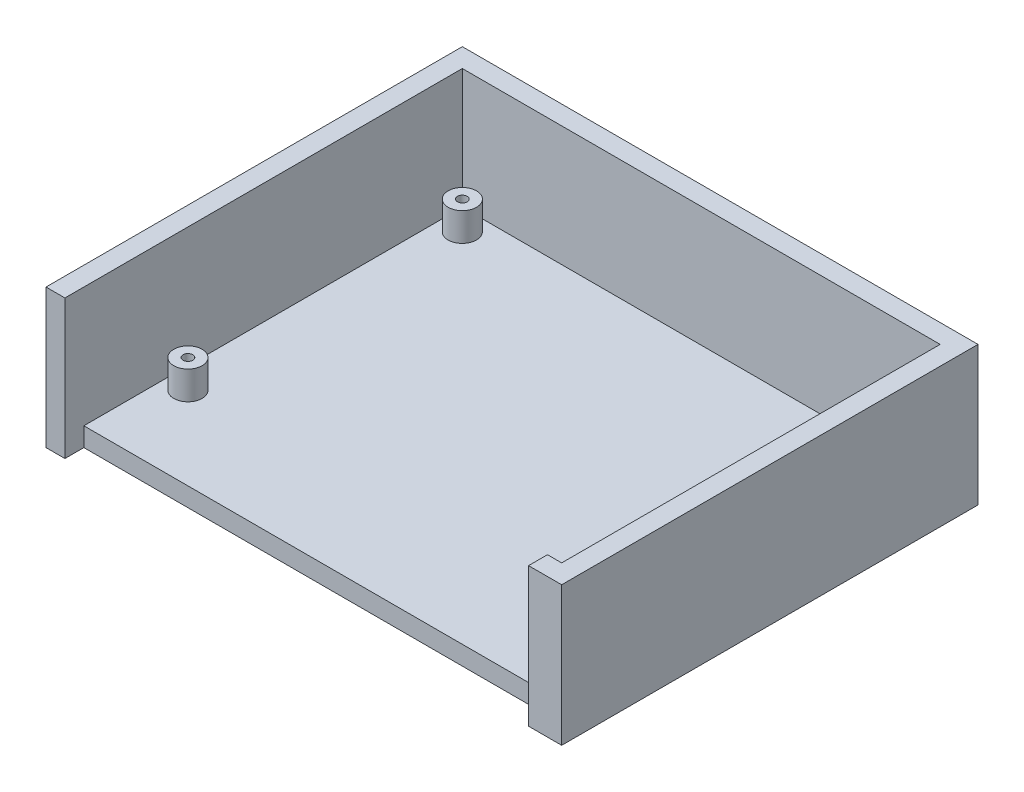
ISO-10303-21;
HEADER;
FILE_DESCRIPTION(('STEP AP214'),'2;1');
FILE_NAME('part.step','',(''),(''),'','','');
FILE_SCHEMA(('AUTOMOTIVE_DESIGN { 1 0 10303 214 1 1 1 1 }'));
ENDSEC;
DATA;
#1=APPLICATION_CONTEXT('core data for automotive mechanical design processes');
#2=APPLICATION_PROTOCOL_DEFINITION('international standard','automotive_design',2000,#1);
#3=PRODUCT_CONTEXT('',#1,'mechanical');
#4=PRODUCT('Part','Part','',(#3));
#5=PRODUCT_RELATED_PRODUCT_CATEGORY('part','',(#4));
#6=PRODUCT_DEFINITION_FORMATION('','',#4);
#7=PRODUCT_DEFINITION_CONTEXT('part definition',#1,'design');
#8=PRODUCT_DEFINITION('design','',#6,#7);
#9=PRODUCT_DEFINITION_SHAPE('','',#8);
#10=(LENGTH_UNIT() NAMED_UNIT(*) SI_UNIT(.MILLI.,.METRE.));
#11=(NAMED_UNIT(*) PLANE_ANGLE_UNIT() SI_UNIT($,.RADIAN.));
#12=(NAMED_UNIT(*) SI_UNIT($,.STERADIAN.) SOLID_ANGLE_UNIT());
#13=UNCERTAINTY_MEASURE_WITH_UNIT(LENGTH_MEASURE(1.E-05),#10,'distance_accuracy_value','');
#14=(GEOMETRIC_REPRESENTATION_CONTEXT(3) GLOBAL_UNCERTAINTY_ASSIGNED_CONTEXT((#13)) GLOBAL_UNIT_ASSIGNED_CONTEXT((#10,
#11,#12)) REPRESENTATION_CONTEXT('',''));
#15=CARTESIAN_POINT('',(0.,0.,0.));
#16=DIRECTION('',(0.,0.,1.));
#17=DIRECTION('',(1.,0.,0.));
#18=AXIS2_PLACEMENT_3D('',#15,#16,#17);
#19=CARTESIAN_POINT('',(50.5,4.,40.));
#20=DIRECTION('',(0.,0.,-1.));
#21=DIRECTION('',(-1.,0.,0.));
#22=AXIS2_PLACEMENT_3D('',#19,#20,#21);
#23=PLANE('',#22);
#24=DIRECTION('',(1.,0.,0.));
#25=VECTOR('',#24,1.);
#26=CARTESIAN_POINT('',(50.5,0.,40.));
#27=LINE('',#26,#25);
#28=CARTESIAN_POINT('',(-50.5,0.,40.));
#29=VERTEX_POINT('',#28);
#30=CARTESIAN_POINT('',(47.5,0.,40.));
#31=VERTEX_POINT('',#30);
#32=EDGE_CURVE('E61',#29,#31,#27,.T.);
#33=ORIENTED_EDGE('',*,*,#32,.T.);
#34=DIRECTION('',(0.,-1.,0.));
#35=VECTOR('',#34,1.);
#36=CARTESIAN_POINT('',(47.5,194.889257261219,40.));
#37=LINE('',#36,#35);
#38=CARTESIAN_POINT('',(47.5,4.,40.));
#39=VERTEX_POINT('',#38);
#40=EDGE_CURVE('E57',#39,#31,#37,.T.);
#41=ORIENTED_EDGE('',*,*,#40,.F.);
#42=DIRECTION('',(1.,0.,0.));
#43=VECTOR('',#42,1.);
#44=CARTESIAN_POINT('',(50.5,4.,40.));
#45=LINE('',#44,#43);
#46=CARTESIAN_POINT('',(-50.5,4.,40.));
#47=VERTEX_POINT('',#46);
#48=EDGE_CURVE('E205',#47,#39,#45,.T.);
#49=ORIENTED_EDGE('',*,*,#48,.F.);
#50=DIRECTION('',(0.,-1.,0.));
#51=VECTOR('',#50,1.);
#52=CARTESIAN_POINT('',(-50.5,4.,40.));
#53=LINE('',#52,#51);
#54=EDGE_CURVE('E12',#47,#29,#53,.T.);
#55=ORIENTED_EDGE('',*,*,#54,.T.);
#56=EDGE_LOOP('',(#33,#41,#49,#55));
#57=FACE_BOUND('',#56,.T.);
#58=ADVANCED_FACE('F43',(#57),#23,.F.);
#59=CARTESIAN_POINT('',(0.,4.,0.));
#60=DIRECTION('',(0.,1.,0.));
#61=DIRECTION('',(0.,0.,1.));
#62=AXIS2_PLACEMENT_3D('',#59,#60,#61);
#63=PLANE('',#62);
#64=CARTESIAN_POINT('',(40.,4.,22.5));
#65=DIRECTION('',(0.,1.,0.));
#66=DIRECTION('',(0.,0.,1.));
#67=AXIS2_PLACEMENT_3D('',#64,#65,#66);
#68=CIRCLE('',#67,3.);
#69=CARTESIAN_POINT('',(40.,4.,25.5));
#70=VERTEX_POINT('',#69);
#71=EDGE_CURVE('E602',#70,#70,#68,.T.);
#72=ORIENTED_EDGE('',*,*,#71,.F.);
#73=EDGE_LOOP('',(#72));
#74=FACE_BOUND('',#73,.T.);
#75=CARTESIAN_POINT('',(40.,4.,-35.5));
#76=DIRECTION('',(0.,1.,0.));
#77=DIRECTION('',(0.,0.,1.));
#78=AXIS2_PLACEMENT_3D('',#75,#76,#77);
#79=CIRCLE('',#78,3.);
#80=CARTESIAN_POINT('',(40.,4.,-32.5));
#81=VERTEX_POINT('',#80);
#82=EDGE_CURVE('E608',#81,#81,#79,.T.);
#83=ORIENTED_EDGE('',*,*,#82,.F.);
#84=EDGE_LOOP('',(#83));
#85=FACE_BOUND('',#84,.T.);
#86=CARTESIAN_POINT('',(-46.,4.,-35.5));
#87=DIRECTION('',(0.,1.,0.));
#88=DIRECTION('',(0.,0.,1.));
#89=AXIS2_PLACEMENT_3D('',#86,#87,#88);
#90=CIRCLE('',#89,3.);
#91=CARTESIAN_POINT('',(-46.,4.,-32.5));
#92=VERTEX_POINT('',#91);
#93=EDGE_CURVE('E614',#92,#92,#90,.T.);
#94=ORIENTED_EDGE('',*,*,#93,.F.);
#95=EDGE_LOOP('',(#94));
#96=FACE_BOUND('',#95,.T.);
#97=CARTESIAN_POINT('',(-46.,4.,22.5));
#98=DIRECTION('',(0.,1.,0.));
#99=DIRECTION('',(0.,0.,1.));
#100=AXIS2_PLACEMENT_3D('',#97,#98,#99);
#101=CIRCLE('',#100,3.);
#102=CARTESIAN_POINT('',(-46.,4.,25.5));
#103=VERTEX_POINT('',#102);
#104=EDGE_CURVE('E229',#103,#103,#101,.T.);
#105=ORIENTED_EDGE('',*,*,#104,.F.);
#106=EDGE_LOOP('',(#105));
#107=FACE_BOUND('',#106,.T.);
#108=DIRECTION('',(0.,0.,1.));
#109=VECTOR('',#108,1.);
#110=CARTESIAN_POINT('',(-50.5,4.,40.));
#111=LINE('',#110,#109);
#112=CARTESIAN_POINT('',(-50.5,4.,-40.));
#113=VERTEX_POINT('',#112);
#114=EDGE_CURVE('E202',#113,#47,#111,.T.);
#115=ORIENTED_EDGE('',*,*,#114,.T.);
#116=ORIENTED_EDGE('',*,*,#48,.T.);
#117=DIRECTION('',(-1.,0.,0.));
#118=VECTOR('',#117,1.);
#119=CARTESIAN_POINT('',(0.,4.,40.));
#120=LINE('',#119,#118);
#121=CARTESIAN_POINT('',(50.5,4.,40.));
#122=VERTEX_POINT('',#121);
#123=EDGE_CURVE('E199',#122,#39,#120,.T.);
#124=ORIENTED_EDGE('',*,*,#123,.F.);
#125=DIRECTION('',(0.,0.,-1.));
#126=VECTOR('',#125,1.);
#127=CARTESIAN_POINT('',(50.5,4.,40.));
#128=LINE('',#127,#126);
#129=CARTESIAN_POINT('',(50.5,4.,-40.));
#130=VERTEX_POINT('',#129);
#131=EDGE_CURVE('E207',#122,#130,#128,.T.);
#132=ORIENTED_EDGE('',*,*,#131,.T.);
#133=DIRECTION('',(-1.,0.,0.));
#134=VECTOR('',#133,1.);
#135=CARTESIAN_POINT('',(50.5,4.,-40.));
#136=LINE('',#135,#134);
#137=EDGE_CURVE('E50',#130,#113,#136,.T.);
#138=ORIENTED_EDGE('',*,*,#137,.T.);
#139=EDGE_LOOP('',(#115,#116,#124,#132,#138));
#140=FACE_BOUND('',#139,.T.);
#141=ADVANCED_FACE('F212',(#74,#85,#96,#107,#140),#63,.T.);
#142=CARTESIAN_POINT('',(0.,0.,0.));
#143=DIRECTION('',(0.,1.,0.));
#144=DIRECTION('',(0.,0.,1.));
#145=AXIS2_PLACEMENT_3D('',#142,#143,#144);
#146=PLANE('',#145);
#147=CARTESIAN_POINT('',(-46.,0.,22.5));
#148=DIRECTION('',(0.,1.,0.));
#149=DIRECTION('',(0.,0.,1.));
#150=AXIS2_PLACEMENT_3D('',#147,#148,#149);
#151=CIRCLE('',#150,1.025);
#152=CARTESIAN_POINT('',(-46.,0.,23.525));
#153=VERTEX_POINT('',#152);
#154=EDGE_CURVE('E576',#153,#153,#151,.T.);
#155=ORIENTED_EDGE('',*,*,#154,.T.);
#156=EDGE_LOOP('',(#155));
#157=FACE_BOUND('',#156,.T.);
#158=CARTESIAN_POINT('',(-46.,0.,-35.5));
#159=DIRECTION('',(0.,1.,0.));
#160=DIRECTION('',(0.,0.,1.));
#161=AXIS2_PLACEMENT_3D('',#158,#159,#160);
#162=CIRCLE('',#161,1.025);
#163=CARTESIAN_POINT('',(-46.,0.,-34.475));
#164=VERTEX_POINT('',#163);
#165=EDGE_CURVE('E586',#164,#164,#162,.T.);
#166=ORIENTED_EDGE('',*,*,#165,.T.);
#167=EDGE_LOOP('',(#166));
#168=FACE_BOUND('',#167,.T.);
#169=CARTESIAN_POINT('',(40.,0.,-35.5));
#170=DIRECTION('',(0.,1.,0.));
#171=DIRECTION('',(0.,0.,1.));
#172=AXIS2_PLACEMENT_3D('',#169,#170,#171);
#173=CIRCLE('',#172,1.025);
#174=CARTESIAN_POINT('',(40.,0.,-34.475));
#175=VERTEX_POINT('',#174);
#176=EDGE_CURVE('E592',#175,#175,#173,.T.);
#177=ORIENTED_EDGE('',*,*,#176,.T.);
#178=EDGE_LOOP('',(#177));
#179=FACE_BOUND('',#178,.T.);
#180=CARTESIAN_POINT('',(40.,0.,22.5));
#181=DIRECTION('',(0.,1.,0.));
#182=DIRECTION('',(0.,0.,1.));
#183=AXIS2_PLACEMENT_3D('',#180,#181,#182);
#184=CIRCLE('',#183,1.025);
#185=CARTESIAN_POINT('',(40.,0.,23.525));
#186=VERTEX_POINT('',#185);
#187=EDGE_CURVE('E598',#186,#186,#184,.T.);
#188=ORIENTED_EDGE('',*,*,#187,.T.);
#189=EDGE_LOOP('',(#188));
#190=FACE_BOUND('',#189,.T.);
#191=ORIENTED_EDGE('',*,*,#32,.F.);
#192=DIRECTION('',(0.,0.,1.));
#193=VECTOR('',#192,1.);
#194=CARTESIAN_POINT('',(-50.5,0.,-40.));
#195=LINE('',#194,#193);
#196=CARTESIAN_POINT('',(-50.5,0.,44.));
#197=VERTEX_POINT('',#196);
#198=EDGE_CURVE('E223',#29,#197,#195,.T.);
#199=ORIENTED_EDGE('',*,*,#198,.T.);
#200=DIRECTION('',(-1.,0.,0.));
#201=VECTOR('',#200,1.);
#202=CARTESIAN_POINT('',(-50.5,0.,44.));
#203=LINE('',#202,#201);
#204=CARTESIAN_POINT('',(-54.5,0.,44.));
#205=VERTEX_POINT('',#204);
#206=EDGE_CURVE('E156',#197,#205,#203,.T.);
#207=ORIENTED_EDGE('',*,*,#206,.T.);
#208=DIRECTION('',(0.,0.,-1.));
#209=VECTOR('',#208,1.);
#210=CARTESIAN_POINT('',(-54.5,0.,44.));
#211=LINE('',#210,#209);
#212=CARTESIAN_POINT('',(-54.5,0.,-44.));
#213=VERTEX_POINT('',#212);
#214=EDGE_CURVE('E140',#205,#213,#211,.T.);
#215=ORIENTED_EDGE('',*,*,#214,.T.);
#216=DIRECTION('',(1.,0.,0.));
#217=VECTOR('',#216,1.);
#218=CARTESIAN_POINT('',(54.5,0.,-44.));
#219=LINE('',#218,#217);
#220=CARTESIAN_POINT('',(54.5,0.,-44.));
#221=VERTEX_POINT('',#220);
#222=EDGE_CURVE('E225',#213,#221,#219,.T.);
#223=ORIENTED_EDGE('',*,*,#222,.T.);
#224=DIRECTION('',(0.,0.,1.));
#225=VECTOR('',#224,1.);
#226=CARTESIAN_POINT('',(54.5,0.,44.));
#227=LINE('',#226,#225);
#228=CARTESIAN_POINT('',(54.5,0.,44.));
#229=VERTEX_POINT('',#228);
#230=EDGE_CURVE('E235',#221,#229,#227,.T.);
#231=ORIENTED_EDGE('',*,*,#230,.T.);
#232=DIRECTION('',(-1.,0.,0.));
#233=VECTOR('',#232,1.);
#234=CARTESIAN_POINT('',(54.5,0.,44.));
#235=LINE('',#234,#233);
#236=CARTESIAN_POINT('',(47.5,0.,44.));
#237=VERTEX_POINT('',#236);
#238=EDGE_CURVE('E152',#229,#237,#235,.T.);
#239=ORIENTED_EDGE('',*,*,#238,.T.);
#240=DIRECTION('',(0.,0.,-1.));
#241=VECTOR('',#240,1.);
#242=CARTESIAN_POINT('',(47.5,0.,44.));
#243=LINE('',#242,#241);
#244=EDGE_CURVE('E149',#237,#31,#243,.T.);
#245=ORIENTED_EDGE('',*,*,#244,.T.);
#246=EDGE_LOOP('',(#191,#199,#207,#215,#223,#231,#239,#245));
#247=FACE_BOUND('',#246,.T.);
#248=ADVANCED_FACE('F240',(#157,#168,#179,#190,#247),#146,.F.);
#249=CARTESIAN_POINT('',(-50.5,194.889257261219,-40.));
#250=DIRECTION('',(1.,0.,0.));
#251=DIRECTION('',(0.,0.,-1.));
#252=AXIS2_PLACEMENT_3D('',#249,#250,#251);
#253=PLANE('',#252);
#254=ORIENTED_EDGE('',*,*,#54,.F.);
#255=ORIENTED_EDGE('',*,*,#114,.F.);
#256=DIRECTION('',(0.,-1.,0.));
#257=VECTOR('',#256,1.);
#258=CARTESIAN_POINT('',(-50.5,194.889257261219,-40.));
#259=LINE('',#258,#257);
#260=CARTESIAN_POINT('',(-50.5,29.4,-40.));
#261=VERTEX_POINT('',#260);
#262=EDGE_CURVE('E160',#261,#113,#259,.T.);
#263=ORIENTED_EDGE('',*,*,#262,.F.);
#264=DIRECTION('',(0.,0.,1.));
#265=VECTOR('',#264,1.);
#266=CARTESIAN_POINT('',(-50.5,29.4,-40.));
#267=LINE('',#266,#265);
#268=CARTESIAN_POINT('',(-50.5,29.4,44.));
#269=VERTEX_POINT('',#268);
#270=EDGE_CURVE('E158',#261,#269,#267,.T.);
#271=ORIENTED_EDGE('',*,*,#270,.T.);
#272=DIRECTION('',(0.,-1.,0.));
#273=VECTOR('',#272,1.);
#274=CARTESIAN_POINT('',(-50.5,194.889257261219,44.));
#275=LINE('',#274,#273);
#276=EDGE_CURVE('E148',#269,#197,#275,.T.);
#277=ORIENTED_EDGE('',*,*,#276,.T.);
#278=ORIENTED_EDGE('',*,*,#198,.F.);
#279=EDGE_LOOP('',(#254,#255,#263,#271,#277,#278));
#280=FACE_BOUND('',#279,.T.);
#281=ADVANCED_FACE('F219',(#280),#253,.T.);
#282=CARTESIAN_POINT('',(0.,29.4,0.));
#283=DIRECTION('',(0.,1.,0.));
#284=DIRECTION('',(0.,0.,1.));
#285=AXIS2_PLACEMENT_3D('',#282,#283,#284);
#286=PLANE('',#285);
#287=ORIENTED_EDGE('',*,*,#270,.F.);
#288=DIRECTION('',(-1.,0.,0.));
#289=VECTOR('',#288,1.);
#290=CARTESIAN_POINT('',(50.5,29.4,-40.));
#291=LINE('',#290,#289);
#292=CARTESIAN_POINT('',(50.5,29.4,-40.));
#293=VERTEX_POINT('',#292);
#294=EDGE_CURVE('E161',#293,#261,#291,.T.);
#295=ORIENTED_EDGE('',*,*,#294,.F.);
#296=DIRECTION('',(0.,0.,-1.));
#297=VECTOR('',#296,1.);
#298=CARTESIAN_POINT('',(50.5,29.4,-40.));
#299=LINE('',#298,#297);
#300=CARTESIAN_POINT('',(50.5,29.4,40.));
#301=VERTEX_POINT('',#300);
#302=EDGE_CURVE('E165',#301,#293,#299,.T.);
#303=ORIENTED_EDGE('',*,*,#302,.F.);
#304=DIRECTION('',(1.,0.,0.));
#305=VECTOR('',#304,1.);
#306=CARTESIAN_POINT('',(47.5,29.4,40.));
#307=LINE('',#306,#305);
#308=CARTESIAN_POINT('',(47.5,29.4,40.));
#309=VERTEX_POINT('',#308);
#310=EDGE_CURVE('E169',#309,#301,#307,.T.);
#311=ORIENTED_EDGE('',*,*,#310,.F.);
#312=DIRECTION('',(0.,0.,-1.));
#313=VECTOR('',#312,1.);
#314=CARTESIAN_POINT('',(47.5,29.4,44.));
#315=LINE('',#314,#313);
#316=CARTESIAN_POINT('',(47.5,29.4,44.));
#317=VERTEX_POINT('',#316);
#318=EDGE_CURVE('E173',#317,#309,#315,.T.);
#319=ORIENTED_EDGE('',*,*,#318,.F.);
#320=DIRECTION('',(-1.,0.,0.));
#321=VECTOR('',#320,1.);
#322=CARTESIAN_POINT('',(54.5,29.4,44.));
#323=LINE('',#322,#321);
#324=CARTESIAN_POINT('',(54.5,29.4,44.));
#325=VERTEX_POINT('',#324);
#326=EDGE_CURVE('E177',#325,#317,#323,.T.);
#327=ORIENTED_EDGE('',*,*,#326,.F.);
#328=DIRECTION('',(0.,0.,1.));
#329=VECTOR('',#328,1.);
#330=CARTESIAN_POINT('',(54.5,29.4,44.));
#331=LINE('',#330,#329);
#332=CARTESIAN_POINT('',(54.5,29.4,-44.));
#333=VERTEX_POINT('',#332);
#334=EDGE_CURVE('E181',#333,#325,#331,.T.);
#335=ORIENTED_EDGE('',*,*,#334,.F.);
#336=DIRECTION('',(1.,0.,0.));
#337=VECTOR('',#336,1.);
#338=CARTESIAN_POINT('',(54.5,29.4,-44.));
#339=LINE('',#338,#337);
#340=CARTESIAN_POINT('',(-54.5,29.4,-44.));
#341=VERTEX_POINT('',#340);
#342=EDGE_CURVE('E131',#341,#333,#339,.T.);
#343=ORIENTED_EDGE('',*,*,#342,.F.);
#344=DIRECTION('',(0.,0.,-1.));
#345=VECTOR('',#344,1.);
#346=CARTESIAN_POINT('',(-54.5,29.4,44.));
#347=LINE('',#346,#345);
#348=CARTESIAN_POINT('',(-54.5,29.4,44.));
#349=VERTEX_POINT('',#348);
#350=EDGE_CURVE('E124',#349,#341,#347,.T.);
#351=ORIENTED_EDGE('',*,*,#350,.F.);
#352=DIRECTION('',(-1.,0.,0.));
#353=VECTOR('',#352,1.);
#354=CARTESIAN_POINT('',(-50.5,29.4,44.));
#355=LINE('',#354,#353);
#356=EDGE_CURVE('E128',#269,#349,#355,.T.);
#357=ORIENTED_EDGE('',*,*,#356,.F.);
#358=EDGE_LOOP('',(#287,#295,#303,#311,#319,#327,#335,#343,#351,#357));
#359=FACE_BOUND('',#358,.T.);
#360=ADVANCED_FACE('F126',(#359),#286,.T.);
#361=CARTESIAN_POINT('',(-50.5,194.889257261219,44.));
#362=DIRECTION('',(0.,0.,1.));
#363=DIRECTION('',(1.,0.,0.));
#364=AXIS2_PLACEMENT_3D('',#361,#362,#363);
#365=PLANE('',#364);
#366=ORIENTED_EDGE('',*,*,#276,.F.);
#367=ORIENTED_EDGE('',*,*,#356,.T.);
#368=DIRECTION('',(0.,-1.,0.));
#369=VECTOR('',#368,1.);
#370=CARTESIAN_POINT('',(-54.5,194.889257261219,44.));
#371=LINE('',#370,#369);
#372=EDGE_CURVE('E135',#349,#205,#371,.T.);
#373=ORIENTED_EDGE('',*,*,#372,.T.);
#374=ORIENTED_EDGE('',*,*,#206,.F.);
#375=EDGE_LOOP('',(#366,#367,#373,#374));
#376=FACE_BOUND('',#375,.T.);
#377=ADVANCED_FACE('F146',(#376),#365,.T.);
#378=CARTESIAN_POINT('',(-54.5,194.889257261219,44.));
#379=DIRECTION('',(-1.,0.,0.));
#380=DIRECTION('',(0.,0.,1.));
#381=AXIS2_PLACEMENT_3D('',#378,#379,#380);
#382=PLANE('',#381);
#383=ORIENTED_EDGE('',*,*,#372,.F.);
#384=ORIENTED_EDGE('',*,*,#350,.T.);
#385=DIRECTION('',(0.,-1.,0.));
#386=VECTOR('',#385,1.);
#387=CARTESIAN_POINT('',(-54.5,194.889257261219,-44.));
#388=LINE('',#387,#386);
#389=EDGE_CURVE('E134',#341,#213,#388,.T.);
#390=ORIENTED_EDGE('',*,*,#389,.T.);
#391=ORIENTED_EDGE('',*,*,#214,.F.);
#392=EDGE_LOOP('',(#383,#384,#390,#391));
#393=FACE_BOUND('',#392,.T.);
#394=ADVANCED_FACE('F138',(#393),#382,.T.);
#395=CARTESIAN_POINT('',(54.5,194.889257261219,-44.));
#396=DIRECTION('',(0.,0.,-1.));
#397=DIRECTION('',(-1.,0.,0.));
#398=AXIS2_PLACEMENT_3D('',#395,#396,#397);
#399=PLANE('',#398);
#400=ORIENTED_EDGE('',*,*,#389,.F.);
#401=ORIENTED_EDGE('',*,*,#342,.T.);
#402=DIRECTION('',(0.,-1.,0.));
#403=VECTOR('',#402,1.);
#404=CARTESIAN_POINT('',(54.5,194.889257261219,-44.));
#405=LINE('',#404,#403);
#406=EDGE_CURVE('E184',#333,#221,#405,.T.);
#407=ORIENTED_EDGE('',*,*,#406,.T.);
#408=ORIENTED_EDGE('',*,*,#222,.F.);
#409=EDGE_LOOP('',(#400,#401,#407,#408));
#410=FACE_BOUND('',#409,.T.);
#411=ADVANCED_FACE('F243',(#410),#399,.T.);
#412=CARTESIAN_POINT('',(54.5,194.889257261219,44.));
#413=DIRECTION('',(1.,0.,0.));
#414=DIRECTION('',(0.,0.,-1.));
#415=AXIS2_PLACEMENT_3D('',#412,#413,#414);
#416=PLANE('',#415);
#417=ORIENTED_EDGE('',*,*,#406,.F.);
#418=ORIENTED_EDGE('',*,*,#334,.T.);
#419=DIRECTION('',(0.,-1.,0.));
#420=VECTOR('',#419,1.);
#421=CARTESIAN_POINT('',(54.5,194.889257261219,44.));
#422=LINE('',#421,#420);
#423=EDGE_CURVE('E180',#325,#229,#422,.T.);
#424=ORIENTED_EDGE('',*,*,#423,.T.);
#425=ORIENTED_EDGE('',*,*,#230,.F.);
#426=EDGE_LOOP('',(#417,#418,#424,#425));
#427=FACE_BOUND('',#426,.T.);
#428=ADVANCED_FACE('F246',(#427),#416,.T.);
#429=CARTESIAN_POINT('',(54.5,194.889257261219,44.));
#430=DIRECTION('',(0.,0.,1.));
#431=DIRECTION('',(1.,0.,0.));
#432=AXIS2_PLACEMENT_3D('',#429,#430,#431);
#433=PLANE('',#432);
#434=ORIENTED_EDGE('',*,*,#423,.F.);
#435=ORIENTED_EDGE('',*,*,#326,.T.);
#436=DIRECTION('',(0.,-1.,0.));
#437=VECTOR('',#436,1.);
#438=CARTESIAN_POINT('',(47.5,194.889257261219,44.));
#439=LINE('',#438,#437);
#440=EDGE_CURVE('E176',#317,#237,#439,.T.);
#441=ORIENTED_EDGE('',*,*,#440,.T.);
#442=ORIENTED_EDGE('',*,*,#238,.F.);
#443=EDGE_LOOP('',(#434,#435,#441,#442));
#444=FACE_BOUND('',#443,.T.);
#445=ADVANCED_FACE('F250',(#444),#433,.T.);
#446=CARTESIAN_POINT('',(47.5,194.889257261219,44.));
#447=DIRECTION('',(-1.,0.,0.));
#448=DIRECTION('',(0.,0.,1.));
#449=AXIS2_PLACEMENT_3D('',#446,#447,#448);
#450=PLANE('',#449);
#451=ORIENTED_EDGE('',*,*,#440,.F.);
#452=ORIENTED_EDGE('',*,*,#318,.T.);
#453=EDGE_CURVE('E172',#309,#39,#37,.T.);
#454=ORIENTED_EDGE('',*,*,#453,.T.);
#455=ORIENTED_EDGE('',*,*,#40,.T.);
#456=ORIENTED_EDGE('',*,*,#244,.F.);
#457=EDGE_LOOP('',(#451,#452,#454,#455,#456));
#458=FACE_BOUND('',#457,.T.);
#459=ADVANCED_FACE('F254',(#458),#450,.T.);
#460=CARTESIAN_POINT('',(47.5,194.889257261219,40.));
#461=DIRECTION('',(0.,0.,-1.));
#462=DIRECTION('',(-1.,0.,0.));
#463=AXIS2_PLACEMENT_3D('',#460,#461,#462);
#464=PLANE('',#463);
#465=DIRECTION('',(0.,-1.,0.));
#466=VECTOR('',#465,1.);
#467=CARTESIAN_POINT('',(50.5,194.889257261219,40.));
#468=LINE('',#467,#466);
#469=EDGE_CURVE('E168',#301,#122,#468,.T.);
#470=ORIENTED_EDGE('',*,*,#469,.T.);
#471=ORIENTED_EDGE('',*,*,#123,.T.);
#472=ORIENTED_EDGE('',*,*,#453,.F.);
#473=ORIENTED_EDGE('',*,*,#310,.T.);
#474=EDGE_LOOP('',(#470,#471,#472,#473));
#475=FACE_BOUND('',#474,.T.);
#476=ADVANCED_FACE('F257',(#475),#464,.T.);
#477=CARTESIAN_POINT('',(50.5,194.889257261219,-40.));
#478=DIRECTION('',(-1.,0.,0.));
#479=DIRECTION('',(0.,0.,1.));
#480=AXIS2_PLACEMENT_3D('',#477,#478,#479);
#481=PLANE('',#480);
#482=DIRECTION('',(0.,-1.,0.));
#483=VECTOR('',#482,1.);
#484=CARTESIAN_POINT('',(50.5,194.889257261219,-40.));
#485=LINE('',#484,#483);
#486=EDGE_CURVE('E164',#293,#130,#485,.T.);
#487=ORIENTED_EDGE('',*,*,#486,.T.);
#488=ORIENTED_EDGE('',*,*,#131,.F.);
#489=ORIENTED_EDGE('',*,*,#469,.F.);
#490=ORIENTED_EDGE('',*,*,#302,.T.);
#491=EDGE_LOOP('',(#487,#488,#489,#490));
#492=FACE_BOUND('',#491,.T.);
#493=ADVANCED_FACE('F259',(#492),#481,.T.);
#494=CARTESIAN_POINT('',(50.5,194.889257261219,-40.));
#495=DIRECTION('',(0.,0.,1.));
#496=DIRECTION('',(1.,0.,0.));
#497=AXIS2_PLACEMENT_3D('',#494,#495,#496);
#498=PLANE('',#497);
#499=ORIENTED_EDGE('',*,*,#262,.T.);
#500=ORIENTED_EDGE('',*,*,#137,.F.);
#501=ORIENTED_EDGE('',*,*,#486,.F.);
#502=ORIENTED_EDGE('',*,*,#294,.T.);
#503=EDGE_LOOP('',(#499,#500,#501,#502));
#504=FACE_BOUND('',#503,.T.);
#505=ADVANCED_FACE('F221',(#504),#498,.T.);
#506=CARTESIAN_POINT('',(-46.,10.,22.5));
#507=DIRECTION('',(0.,-1.,0.));
#508=DIRECTION('',(0.,0.,-1.));
#509=AXIS2_PLACEMENT_3D('',#506,#507,#508);
#510=CYLINDRICAL_SURFACE('',#509,3.);
#511=CARTESIAN_POINT('',(-46.,10.,22.5));
#512=DIRECTION('',(0.,1.,0.));
#513=DIRECTION('',(0.,0.,1.));
#514=AXIS2_PLACEMENT_3D('',#511,#512,#513);
#515=CIRCLE('',#514,3.);
#516=CARTESIAN_POINT('',(-46.,10.,25.5));
#517=VERTEX_POINT('',#516);
#518=EDGE_CURVE('E226',#517,#517,#515,.T.);
#519=ORIENTED_EDGE('',*,*,#518,.F.);
#520=EDGE_LOOP('',(#519));
#521=FACE_BOUND('',#520,.T.);
#522=ORIENTED_EDGE('',*,*,#104,.T.);
#523=EDGE_LOOP('',(#522));
#524=FACE_BOUND('',#523,.T.);
#525=ADVANCED_FACE('F266',(#521,#524),#510,.T.);
#526=CARTESIAN_POINT('',(-46.,10.,22.5));
#527=DIRECTION('',(0.,1.,0.));
#528=DIRECTION('',(0.,0.,1.));
#529=AXIS2_PLACEMENT_3D('',#526,#527,#528);
#530=PLANE('',#529);
#531=CARTESIAN_POINT('',(-46.,10.,22.5));
#532=DIRECTION('',(0.,1.,0.));
#533=DIRECTION('',(0.,0.,1.));
#534=AXIS2_PLACEMENT_3D('',#531,#532,#533);
#535=CIRCLE('',#534,1.025);
#536=CARTESIAN_POINT('',(-46.,10.,23.525));
#537=VERTEX_POINT('',#536);
#538=EDGE_CURVE('E579',#537,#537,#535,.T.);
#539=ORIENTED_EDGE('',*,*,#538,.F.);
#540=EDGE_LOOP('',(#539));
#541=FACE_BOUND('',#540,.T.);
#542=ORIENTED_EDGE('',*,*,#518,.T.);
#543=EDGE_LOOP('',(#542));
#544=FACE_BOUND('',#543,.T.);
#545=ADVANCED_FACE('F332',(#541,#544),#530,.T.);
#546=CARTESIAN_POINT('',(-46.,10.,-35.5));
#547=DIRECTION('',(0.,-1.,0.));
#548=DIRECTION('',(0.,0.,-1.));
#549=AXIS2_PLACEMENT_3D('',#546,#547,#548);
#550=CYLINDRICAL_SURFACE('',#549,3.);
#551=CARTESIAN_POINT('',(-46.,10.,-35.5));
#552=DIRECTION('',(0.,1.,0.));
#553=DIRECTION('',(0.,0.,1.));
#554=AXIS2_PLACEMENT_3D('',#551,#552,#553);
#555=CIRCLE('',#554,3.);
#556=CARTESIAN_POINT('',(-46.,10.,-32.5));
#557=VERTEX_POINT('',#556);
#558=EDGE_CURVE('E611',#557,#557,#555,.T.);
#559=ORIENTED_EDGE('',*,*,#558,.F.);
#560=EDGE_LOOP('',(#559));
#561=FACE_BOUND('',#560,.T.);
#562=ORIENTED_EDGE('',*,*,#93,.T.);
#563=EDGE_LOOP('',(#562));
#564=FACE_BOUND('',#563,.T.);
#565=ADVANCED_FACE('F341',(#561,#564),#550,.T.);
#566=CARTESIAN_POINT('',(-46.,10.,-35.5));
#567=DIRECTION('',(0.,1.,0.));
#568=DIRECTION('',(0.,0.,1.));
#569=AXIS2_PLACEMENT_3D('',#566,#567,#568);
#570=PLANE('',#569);
#571=CARTESIAN_POINT('',(-46.,10.,-35.5));
#572=DIRECTION('',(0.,1.,0.));
#573=DIRECTION('',(0.,0.,1.));
#574=AXIS2_PLACEMENT_3D('',#571,#572,#573);
#575=CIRCLE('',#574,1.025);
#576=CARTESIAN_POINT('',(-46.,10.,-34.475));
#577=VERTEX_POINT('',#576);
#578=EDGE_CURVE('E581',#577,#577,#575,.T.);
#579=ORIENTED_EDGE('',*,*,#578,.F.);
#580=EDGE_LOOP('',(#579));
#581=FACE_BOUND('',#580,.T.);
#582=ORIENTED_EDGE('',*,*,#558,.T.);
#583=EDGE_LOOP('',(#582));
#584=FACE_BOUND('',#583,.T.);
#585=ADVANCED_FACE('F346',(#581,#584),#570,.T.);
#586=CARTESIAN_POINT('',(40.,10.,-35.5));
#587=DIRECTION('',(0.,-1.,0.));
#588=DIRECTION('',(0.,0.,-1.));
#589=AXIS2_PLACEMENT_3D('',#586,#587,#588);
#590=CYLINDRICAL_SURFACE('',#589,3.);
#591=CARTESIAN_POINT('',(40.,10.,-35.5));
#592=DIRECTION('',(0.,1.,0.));
#593=DIRECTION('',(0.,0.,1.));
#594=AXIS2_PLACEMENT_3D('',#591,#592,#593);
#595=CIRCLE('',#594,3.);
#596=CARTESIAN_POINT('',(40.,10.,-32.5));
#597=VERTEX_POINT('',#596);
#598=EDGE_CURVE('E605',#597,#597,#595,.T.);
#599=ORIENTED_EDGE('',*,*,#598,.F.);
#600=EDGE_LOOP('',(#599));
#601=FACE_BOUND('',#600,.T.);
#602=ORIENTED_EDGE('',*,*,#82,.T.);
#603=EDGE_LOOP('',(#602));
#604=FACE_BOUND('',#603,.T.);
#605=ADVANCED_FACE('F355',(#601,#604),#590,.T.);
#606=CARTESIAN_POINT('',(40.,10.,-35.5));
#607=DIRECTION('',(0.,1.,0.));
#608=DIRECTION('',(0.,0.,1.));
#609=AXIS2_PLACEMENT_3D('',#606,#607,#608);
#610=PLANE('',#609);
#611=CARTESIAN_POINT('',(40.,10.,-35.5));
#612=DIRECTION('',(0.,1.,0.));
#613=DIRECTION('',(0.,0.,1.));
#614=AXIS2_PLACEMENT_3D('',#611,#612,#613);
#615=CIRCLE('',#614,1.025);
#616=CARTESIAN_POINT('',(40.,10.,-34.475));
#617=VERTEX_POINT('',#616);
#618=EDGE_CURVE('E589',#617,#617,#615,.T.);
#619=ORIENTED_EDGE('',*,*,#618,.F.);
#620=EDGE_LOOP('',(#619));
#621=FACE_BOUND('',#620,.T.);
#622=ORIENTED_EDGE('',*,*,#598,.T.);
#623=EDGE_LOOP('',(#622));
#624=FACE_BOUND('',#623,.T.);
#625=ADVANCED_FACE('F360',(#621,#624),#610,.T.);
#626=CARTESIAN_POINT('',(40.,10.,22.5));
#627=DIRECTION('',(0.,-1.,0.));
#628=DIRECTION('',(0.,0.,-1.));
#629=AXIS2_PLACEMENT_3D('',#626,#627,#628);
#630=CYLINDRICAL_SURFACE('',#629,3.);
#631=CARTESIAN_POINT('',(40.,10.,22.5));
#632=DIRECTION('',(0.,1.,0.));
#633=DIRECTION('',(0.,0.,1.));
#634=AXIS2_PLACEMENT_3D('',#631,#632,#633);
#635=CIRCLE('',#634,3.);
#636=CARTESIAN_POINT('',(40.,10.,25.5));
#637=VERTEX_POINT('',#636);
#638=EDGE_CURVE('E601',#637,#637,#635,.T.);
#639=ORIENTED_EDGE('',*,*,#638,.F.);
#640=EDGE_LOOP('',(#639));
#641=FACE_BOUND('',#640,.T.);
#642=ORIENTED_EDGE('',*,*,#71,.T.);
#643=EDGE_LOOP('',(#642));
#644=FACE_BOUND('',#643,.T.);
#645=ADVANCED_FACE('F369',(#641,#644),#630,.T.);
#646=CARTESIAN_POINT('',(40.,10.,22.5));
#647=DIRECTION('',(0.,1.,0.));
#648=DIRECTION('',(0.,0.,1.));
#649=AXIS2_PLACEMENT_3D('',#646,#647,#648);
#650=PLANE('',#649);
#651=CARTESIAN_POINT('',(40.,10.,22.5));
#652=DIRECTION('',(0.,1.,0.));
#653=DIRECTION('',(0.,0.,1.));
#654=AXIS2_PLACEMENT_3D('',#651,#652,#653);
#655=CIRCLE('',#654,1.025);
#656=CARTESIAN_POINT('',(40.,10.,23.525));
#657=VERTEX_POINT('',#656);
#658=EDGE_CURVE('E595',#657,#657,#655,.T.);
#659=ORIENTED_EDGE('',*,*,#658,.F.);
#660=EDGE_LOOP('',(#659));
#661=FACE_BOUND('',#660,.T.);
#662=ORIENTED_EDGE('',*,*,#638,.T.);
#663=EDGE_LOOP('',(#662));
#664=FACE_BOUND('',#663,.T.);
#665=ADVANCED_FACE('F374',(#661,#664),#650,.T.);
#666=CARTESIAN_POINT('',(40.,10.,22.5));
#667=DIRECTION('',(0.,1.,0.));
#668=DIRECTION('',(0.,0.,1.));
#669=AXIS2_PLACEMENT_3D('',#666,#667,#668);
#670=CYLINDRICAL_SURFACE('',#669,1.025);
#671=ORIENTED_EDGE('',*,*,#187,.F.);
#672=EDGE_LOOP('',(#671));
#673=FACE_BOUND('',#672,.T.);
#674=ORIENTED_EDGE('',*,*,#658,.T.);
#675=EDGE_LOOP('',(#674));
#676=FACE_BOUND('',#675,.T.);
#677=ADVANCED_FACE('F424',(#673,#676),#670,.F.);
#678=CARTESIAN_POINT('',(40.,10.,-35.5));
#679=DIRECTION('',(0.,1.,0.));
#680=DIRECTION('',(0.,0.,1.));
#681=AXIS2_PLACEMENT_3D('',#678,#679,#680);
#682=CYLINDRICAL_SURFACE('',#681,1.025);
#683=ORIENTED_EDGE('',*,*,#176,.F.);
#684=EDGE_LOOP('',(#683));
#685=FACE_BOUND('',#684,.T.);
#686=ORIENTED_EDGE('',*,*,#618,.T.);
#687=EDGE_LOOP('',(#686));
#688=FACE_BOUND('',#687,.T.);
#689=ADVANCED_FACE('F437',(#685,#688),#682,.F.);
#690=CARTESIAN_POINT('',(-46.,10.,-35.5));
#691=DIRECTION('',(0.,1.,0.));
#692=DIRECTION('',(0.,0.,1.));
#693=AXIS2_PLACEMENT_3D('',#690,#691,#692);
#694=CYLINDRICAL_SURFACE('',#693,1.025);
#695=ORIENTED_EDGE('',*,*,#165,.F.);
#696=EDGE_LOOP('',(#695));
#697=FACE_BOUND('',#696,.T.);
#698=ORIENTED_EDGE('',*,*,#578,.T.);
#699=EDGE_LOOP('',(#698));
#700=FACE_BOUND('',#699,.T.);
#701=ADVANCED_FACE('F449',(#697,#700),#694,.F.);
#702=CARTESIAN_POINT('',(-46.,10.,22.5));
#703=DIRECTION('',(0.,1.,0.));
#704=DIRECTION('',(0.,0.,1.));
#705=AXIS2_PLACEMENT_3D('',#702,#703,#704);
#706=CYLINDRICAL_SURFACE('',#705,1.025);
#707=ORIENTED_EDGE('',*,*,#154,.F.);
#708=EDGE_LOOP('',(#707));
#709=FACE_BOUND('',#708,.T.);
#710=ORIENTED_EDGE('',*,*,#538,.T.);
#711=EDGE_LOOP('',(#710));
#712=FACE_BOUND('',#711,.T.);
#713=ADVANCED_FACE('F461',(#709,#712),#706,.F.);
#714=CLOSED_SHELL('',(#58,#141,#248,#281,#360,#377,#394,#411,#428,#445,#459,#476,#493,#505,#525,
#545,#565,#585,#605,#625,#645,#665,#677,#689,#701,#713));
#715=MANIFOLD_SOLID_BREP('B2',#714);
#716=ADVANCED_BREP_SHAPE_REPRESENTATION('',(#18,#715),#14);
#717=SHAPE_DEFINITION_REPRESENTATION(#9,#716);
ENDSEC;
END-ISO-10303-21;
